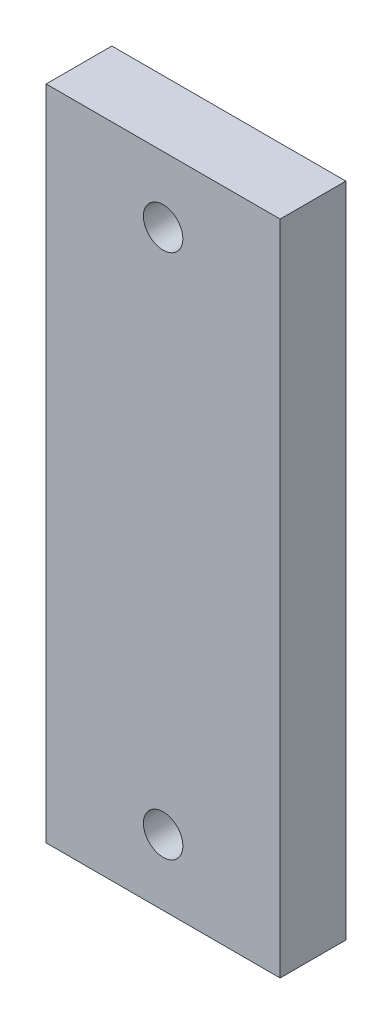
ISO-10303-21;
HEADER;
FILE_DESCRIPTION(('STEP AP214'),'2;1');
FILE_NAME('part.step','',(''),(''),'','','');
FILE_SCHEMA(('AUTOMOTIVE_DESIGN { 1 0 10303 214 1 1 1 1 }'));
ENDSEC;
DATA;
#1=APPLICATION_CONTEXT('core data for automotive mechanical design processes');
#2=APPLICATION_PROTOCOL_DEFINITION('international standard','automotive_design',2000,#1);
#3=PRODUCT_CONTEXT('',#1,'mechanical');
#4=PRODUCT('Part','Part','',(#3));
#5=PRODUCT_RELATED_PRODUCT_CATEGORY('part','',(#4));
#6=PRODUCT_DEFINITION_FORMATION('','',#4);
#7=PRODUCT_DEFINITION_CONTEXT('part definition',#1,'design');
#8=PRODUCT_DEFINITION('design','',#6,#7);
#9=PRODUCT_DEFINITION_SHAPE('','',#8);
#10=(LENGTH_UNIT() NAMED_UNIT(*) SI_UNIT(.MILLI.,.METRE.));
#11=(NAMED_UNIT(*) PLANE_ANGLE_UNIT() SI_UNIT($,.RADIAN.));
#12=(NAMED_UNIT(*) SI_UNIT($,.STERADIAN.) SOLID_ANGLE_UNIT());
#13=UNCERTAINTY_MEASURE_WITH_UNIT(LENGTH_MEASURE(1.E-05),#10,'distance_accuracy_value','');
#14=(GEOMETRIC_REPRESENTATION_CONTEXT(3) GLOBAL_UNCERTAINTY_ASSIGNED_CONTEXT((#13)) GLOBAL_UNIT_ASSIGNED_CONTEXT((#10,
#11,#12)) REPRESENTATION_CONTEXT('',''));
#15=CARTESIAN_POINT('',(0.,0.,0.));
#16=DIRECTION('',(0.,0.,1.));
#17=DIRECTION('',(1.,0.,0.));
#18=AXIS2_PLACEMENT_3D('',#15,#16,#17);
#19=CARTESIAN_POINT('',(0.,0.,-5.));
#20=DIRECTION('',(0.,0.,1.));
#21=DIRECTION('',(-1.,0.,0.));
#22=AXIS2_PLACEMENT_3D('',#19,#20,#21);
#23=PLANE('',#22);
#24=DIRECTION('',(0.,1.,0.));
#25=VECTOR('',#24,1.);
#26=CARTESIAN_POINT('',(8.9,-25.,-5.));
#27=LINE('',#26,#25);
#28=CARTESIAN_POINT('',(8.9,-25.,-5.));
#29=VERTEX_POINT('',#28);
#30=CARTESIAN_POINT('',(8.9,25.,-5.));
#31=VERTEX_POINT('',#30);
#32=EDGE_CURVE('E99',#29,#31,#27,.T.);
#33=ORIENTED_EDGE('',*,*,#32,.F.);
#34=DIRECTION('',(1.,0.,0.));
#35=VECTOR('',#34,1.);
#36=CARTESIAN_POINT('',(-8.9,-25.,-5.));
#37=LINE('',#36,#35);
#38=CARTESIAN_POINT('',(-8.9,-25.,-5.));
#39=VERTEX_POINT('',#38);
#40=EDGE_CURVE('E102',#39,#29,#37,.T.);
#41=ORIENTED_EDGE('',*,*,#40,.F.);
#42=DIRECTION('',(0.,-1.,0.));
#43=VECTOR('',#42,1.);
#44=CARTESIAN_POINT('',(-8.9,-25.,-5.));
#45=LINE('',#44,#43);
#46=CARTESIAN_POINT('',(-8.9,25.,-5.));
#47=VERTEX_POINT('',#46);
#48=EDGE_CURVE('E90',#47,#39,#45,.T.);
#49=ORIENTED_EDGE('',*,*,#48,.F.);
#50=DIRECTION('',(-1.,0.,0.));
#51=VECTOR('',#50,1.);
#52=CARTESIAN_POINT('',(-8.9,25.,-5.));
#53=LINE('',#52,#51);
#54=EDGE_CURVE('E95',#31,#47,#53,.T.);
#55=ORIENTED_EDGE('',*,*,#54,.F.);
#56=EDGE_LOOP('',(#33,#41,#49,#55));
#57=FACE_BOUND('',#56,.T.);
#58=CARTESIAN_POINT('',(0.,-20.,-5.));
#59=DIRECTION('',(0.,0.,1.));
#60=DIRECTION('',(1.,0.,0.));
#61=AXIS2_PLACEMENT_3D('',#58,#59,#60);
#62=CIRCLE('',#61,1.5);
#63=CARTESIAN_POINT('',(1.5,-20.,-5.));
#64=VERTEX_POINT('',#63);
#65=EDGE_CURVE('E111',#64,#64,#62,.T.);
#66=ORIENTED_EDGE('',*,*,#65,.T.);
#67=EDGE_LOOP('',(#66));
#68=FACE_BOUND('',#67,.T.);
#69=CARTESIAN_POINT('',(0.,20.,-5.));
#70=DIRECTION('',(0.,0.,1.));
#71=DIRECTION('',(1.,0.,0.));
#72=AXIS2_PLACEMENT_3D('',#69,#70,#71);
#73=CIRCLE('',#72,1.5);
#74=CARTESIAN_POINT('',(1.5,20.,-5.));
#75=VERTEX_POINT('',#74);
#76=EDGE_CURVE('E122',#75,#75,#73,.T.);
#77=ORIENTED_EDGE('',*,*,#76,.T.);
#78=EDGE_LOOP('',(#77));
#79=FACE_BOUND('',#78,.T.);
#80=ADVANCED_FACE('F43',(#57,#68,#79),#23,.F.);
#81=CARTESIAN_POINT('',(0.,0.,0.));
#82=DIRECTION('',(0.,0.,1.));
#83=DIRECTION('',(-1.,0.,0.));
#84=AXIS2_PLACEMENT_3D('',#81,#82,#83);
#85=PLANE('',#84);
#86=CARTESIAN_POINT('',(0.,-20.,0.));
#87=DIRECTION('',(0.,0.,1.));
#88=DIRECTION('',(1.,0.,0.));
#89=AXIS2_PLACEMENT_3D('',#86,#87,#88);
#90=CIRCLE('',#89,1.5);
#91=CARTESIAN_POINT('',(1.5,-20.,0.));
#92=VERTEX_POINT('',#91);
#93=EDGE_CURVE('E119',#92,#92,#90,.T.);
#94=ORIENTED_EDGE('',*,*,#93,.F.);
#95=EDGE_LOOP('',(#94));
#96=FACE_BOUND('',#95,.T.);
#97=DIRECTION('',(0.,1.,0.));
#98=VECTOR('',#97,1.);
#99=CARTESIAN_POINT('',(8.9,-25.,0.));
#100=LINE('',#99,#98);
#101=CARTESIAN_POINT('',(8.9,-25.,0.));
#102=VERTEX_POINT('',#101);
#103=CARTESIAN_POINT('',(8.9,25.,0.));
#104=VERTEX_POINT('',#103);
#105=EDGE_CURVE('E107',#102,#104,#100,.T.);
#106=ORIENTED_EDGE('',*,*,#105,.T.);
#107=DIRECTION('',(-1.,0.,0.));
#108=VECTOR('',#107,1.);
#109=CARTESIAN_POINT('',(-8.9,25.,0.));
#110=LINE('',#109,#108);
#111=CARTESIAN_POINT('',(-8.9,25.,0.));
#112=VERTEX_POINT('',#111);
#113=EDGE_CURVE('E110',#104,#112,#110,.T.);
#114=ORIENTED_EDGE('',*,*,#113,.T.);
#115=DIRECTION('',(0.,-1.,0.));
#116=VECTOR('',#115,1.);
#117=CARTESIAN_POINT('',(-8.9,-25.,0.));
#118=LINE('',#117,#116);
#119=CARTESIAN_POINT('',(-8.9,-25.,0.));
#120=VERTEX_POINT('',#119);
#121=EDGE_CURVE('E93',#112,#120,#118,.T.);
#122=ORIENTED_EDGE('',*,*,#121,.T.);
#123=DIRECTION('',(1.,0.,0.));
#124=VECTOR('',#123,1.);
#125=CARTESIAN_POINT('',(-8.9,-25.,0.));
#126=LINE('',#125,#124);
#127=EDGE_CURVE('E114',#120,#102,#126,.T.);
#128=ORIENTED_EDGE('',*,*,#127,.T.);
#129=EDGE_LOOP('',(#106,#114,#122,#128));
#130=FACE_BOUND('',#129,.T.);
#131=CARTESIAN_POINT('',(0.,20.,0.));
#132=DIRECTION('',(0.,0.,1.));
#133=DIRECTION('',(1.,0.,0.));
#134=AXIS2_PLACEMENT_3D('',#131,#132,#133);
#135=CIRCLE('',#134,1.5);
#136=CARTESIAN_POINT('',(1.5,20.,0.));
#137=VERTEX_POINT('',#136);
#138=EDGE_CURVE('E125',#137,#137,#135,.T.);
#139=ORIENTED_EDGE('',*,*,#138,.F.);
#140=EDGE_LOOP('',(#139));
#141=FACE_BOUND('',#140,.T.);
#142=ADVANCED_FACE('F139',(#96,#130,#141),#85,.T.);
#143=CARTESIAN_POINT('',(8.9,-25.,-5.));
#144=DIRECTION('',(-1.,0.,0.));
#145=DIRECTION('',(0.,0.,-1.));
#146=AXIS2_PLACEMENT_3D('',#143,#144,#145);
#147=PLANE('',#146);
#148=ORIENTED_EDGE('',*,*,#105,.F.);
#149=DIRECTION('',(0.,0.,1.));
#150=VECTOR('',#149,1.);
#151=CARTESIAN_POINT('',(8.9,-25.,-5.));
#152=LINE('',#151,#150);
#153=EDGE_CURVE('E60',#29,#102,#152,.T.);
#154=ORIENTED_EDGE('',*,*,#153,.F.);
#155=ORIENTED_EDGE('',*,*,#32,.T.);
#156=DIRECTION('',(0.,0.,1.));
#157=VECTOR('',#156,1.);
#158=CARTESIAN_POINT('',(8.9,25.,-5.));
#159=LINE('',#158,#157);
#160=EDGE_CURVE('E11',#31,#104,#159,.T.);
#161=ORIENTED_EDGE('',*,*,#160,.T.);
#162=EDGE_LOOP('',(#148,#154,#155,#161));
#163=FACE_BOUND('',#162,.T.);
#164=ADVANCED_FACE('F45',(#163),#147,.F.);
#165=CARTESIAN_POINT('',(-8.9,25.,-5.));
#166=DIRECTION('',(0.,-1.,0.));
#167=DIRECTION('',(0.,0.,1.));
#168=AXIS2_PLACEMENT_3D('',#165,#166,#167);
#169=PLANE('',#168);
#170=ORIENTED_EDGE('',*,*,#113,.F.);
#171=ORIENTED_EDGE('',*,*,#160,.F.);
#172=ORIENTED_EDGE('',*,*,#54,.T.);
#173=DIRECTION('',(0.,0.,1.));
#174=VECTOR('',#173,1.);
#175=CARTESIAN_POINT('',(-8.9,25.,-5.));
#176=LINE('',#175,#174);
#177=EDGE_CURVE('E52',#47,#112,#176,.T.);
#178=ORIENTED_EDGE('',*,*,#177,.T.);
#179=EDGE_LOOP('',(#170,#171,#172,#178));
#180=FACE_BOUND('',#179,.T.);
#181=ADVANCED_FACE('F96',(#180),#169,.F.);
#182=CARTESIAN_POINT('',(-8.9,-25.,-5.));
#183=DIRECTION('',(1.,0.,0.));
#184=DIRECTION('',(0.,0.,1.));
#185=AXIS2_PLACEMENT_3D('',#182,#183,#184);
#186=PLANE('',#185);
#187=ORIENTED_EDGE('',*,*,#121,.F.);
#188=ORIENTED_EDGE('',*,*,#177,.F.);
#189=ORIENTED_EDGE('',*,*,#48,.T.);
#190=DIRECTION('',(0.,0.,1.));
#191=VECTOR('',#190,1.);
#192=CARTESIAN_POINT('',(-8.9,-25.,-5.));
#193=LINE('',#192,#191);
#194=EDGE_CURVE('E76',#39,#120,#193,.T.);
#195=ORIENTED_EDGE('',*,*,#194,.T.);
#196=EDGE_LOOP('',(#187,#188,#189,#195));
#197=FACE_BOUND('',#196,.T.);
#198=ADVANCED_FACE('F88',(#197),#186,.F.);
#199=CARTESIAN_POINT('',(-8.9,-25.,-5.));
#200=DIRECTION('',(0.,1.,0.));
#201=DIRECTION('',(0.,0.,-1.));
#202=AXIS2_PLACEMENT_3D('',#199,#200,#201);
#203=PLANE('',#202);
#204=ORIENTED_EDGE('',*,*,#127,.F.);
#205=ORIENTED_EDGE('',*,*,#194,.F.);
#206=ORIENTED_EDGE('',*,*,#40,.T.);
#207=ORIENTED_EDGE('',*,*,#153,.T.);
#208=EDGE_LOOP('',(#204,#205,#206,#207));
#209=FACE_BOUND('',#208,.T.);
#210=ADVANCED_FACE('F151',(#209),#203,.F.);
#211=CARTESIAN_POINT('',(0.,-20.,-5.));
#212=DIRECTION('',(0.,0.,1.));
#213=DIRECTION('',(-1.,0.,0.));
#214=AXIS2_PLACEMENT_3D('',#211,#212,#213);
#215=CYLINDRICAL_SURFACE('',#214,1.5);
#216=ORIENTED_EDGE('',*,*,#65,.F.);
#217=EDGE_LOOP('',(#216));
#218=FACE_BOUND('',#217,.T.);
#219=ORIENTED_EDGE('',*,*,#93,.T.);
#220=EDGE_LOOP('',(#219));
#221=FACE_BOUND('',#220,.T.);
#222=ADVANCED_FACE('F135',(#218,#221),#215,.F.);
#223=CARTESIAN_POINT('',(0.,20.,-5.));
#224=DIRECTION('',(0.,0.,1.));
#225=DIRECTION('',(-1.,0.,0.));
#226=AXIS2_PLACEMENT_3D('',#223,#224,#225);
#227=CYLINDRICAL_SURFACE('',#226,1.5);
#228=ORIENTED_EDGE('',*,*,#76,.F.);
#229=EDGE_LOOP('',(#228));
#230=FACE_BOUND('',#229,.T.);
#231=ORIENTED_EDGE('',*,*,#138,.T.);
#232=EDGE_LOOP('',(#231));
#233=FACE_BOUND('',#232,.T.);
#234=ADVANCED_FACE('F132',(#230,#233),#227,.F.);
#235=CLOSED_SHELL('',(#80,#142,#164,#181,#198,#210,#222,#234));
#236=MANIFOLD_SOLID_BREP('B2',#235);
#237=ADVANCED_BREP_SHAPE_REPRESENTATION('',(#18,#236),#14);
#238=SHAPE_DEFINITION_REPRESENTATION(#9,#237);
ENDSEC;
END-ISO-10303-21;
